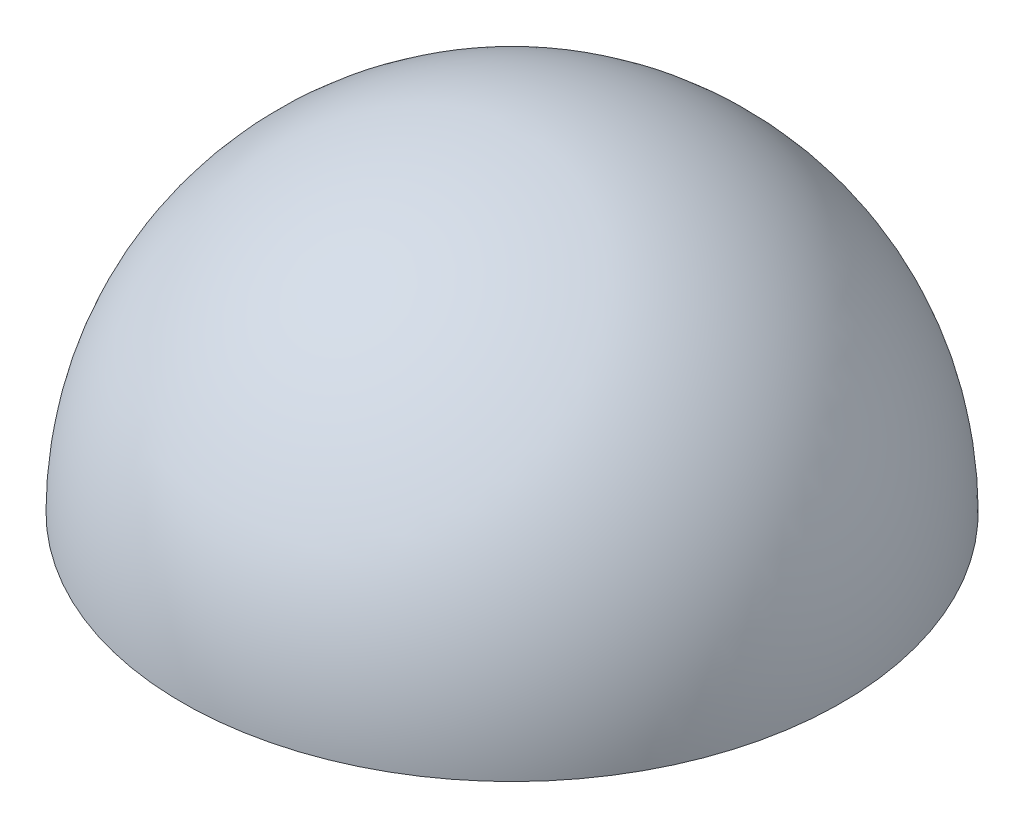
ISO-10303-21;
HEADER;
FILE_DESCRIPTION(('STEP AP214'),'2;1');
FILE_NAME('part.step','',(''),(''),'','','');
FILE_SCHEMA(('AUTOMOTIVE_DESIGN { 1 0 10303 214 1 1 1 1 }'));
ENDSEC;
DATA;
#1=APPLICATION_CONTEXT('core data for automotive mechanical design processes');
#2=APPLICATION_PROTOCOL_DEFINITION('international standard','automotive_design',2000,#1);
#3=PRODUCT_CONTEXT('',#1,'mechanical');
#4=PRODUCT('Part','Part','',(#3));
#5=PRODUCT_RELATED_PRODUCT_CATEGORY('part','',(#4));
#6=PRODUCT_DEFINITION_FORMATION('','',#4);
#7=PRODUCT_DEFINITION_CONTEXT('part definition',#1,'design');
#8=PRODUCT_DEFINITION('design','',#6,#7);
#9=PRODUCT_DEFINITION_SHAPE('','',#8);
#10=(LENGTH_UNIT() NAMED_UNIT(*) SI_UNIT(.MILLI.,.METRE.));
#11=(NAMED_UNIT(*) PLANE_ANGLE_UNIT() SI_UNIT($,.RADIAN.));
#12=(NAMED_UNIT(*) SI_UNIT($,.STERADIAN.) SOLID_ANGLE_UNIT());
#13=UNCERTAINTY_MEASURE_WITH_UNIT(LENGTH_MEASURE(1.E-05),#10,'distance_accuracy_value','');
#14=(GEOMETRIC_REPRESENTATION_CONTEXT(3) GLOBAL_UNCERTAINTY_ASSIGNED_CONTEXT((#13)) GLOBAL_UNIT_ASSIGNED_CONTEXT((#10,
#11,#12)) REPRESENTATION_CONTEXT('',''));
#15=CARTESIAN_POINT('',(0.,0.,0.));
#16=DIRECTION('',(0.,0.,1.));
#17=DIRECTION('',(1.,0.,0.));
#18=AXIS2_PLACEMENT_3D('',#15,#16,#17);
#19=CARTESIAN_POINT('',(0.,0.,0.));
#20=DIRECTION('',(0.,-1.,0.));
#21=DIRECTION('',(0.,0.,-1.));
#22=AXIS2_PLACEMENT_3D('',#19,#20,#21);
#23=PLANE('',#22);
#24=CARTESIAN_POINT('',(0.,0.,0.));
#25=DIRECTION('',(0.,-1.,0.));
#26=DIRECTION('',(0.,0.,-1.));
#27=AXIS2_PLACEMENT_3D('',#24,#25,#26);
#28=CIRCLE('',#27,45.);
#29=CARTESIAN_POINT('',(0.,0.,-45.));
#30=VERTEX_POINT('',#29);
#31=EDGE_CURVE('E10',#30,#30,#28,.T.);
#32=ORIENTED_EDGE('',*,*,#31,.T.);
#33=EDGE_LOOP('',(#32));
#34=FACE_BOUND('',#33,.T.);
#35=ADVANCED_FACE('F41',(#34),#23,.T.);
#36=CARTESIAN_POINT('',(0.,-1.07552855510562E-13,1.07552855510562E-13));
#37=DIRECTION('',(0.,-1.,0.));
#38=DIRECTION('',(0.,0.,-1.));
#39=AXIS2_PLACEMENT_3D('',#36,#37,#38);
#40=SPHERICAL_SURFACE('',#39,45.0000000000001);
#41=ORIENTED_EDGE('',*,*,#31,.F.);
#42=EDGE_LOOP('',(#41));
#43=FACE_BOUND('',#42,.T.);
#44=ADVANCED_FACE('F50',(#43),#40,.T.);
#45=CLOSED_SHELL('',(#35,#44));
#46=MANIFOLD_SOLID_BREP('B2',#45);
#47=ADVANCED_BREP_SHAPE_REPRESENTATION('',(#18,#46),#14);
#48=SHAPE_DEFINITION_REPRESENTATION(#9,#47);
ENDSEC;
END-ISO-10303-21;
